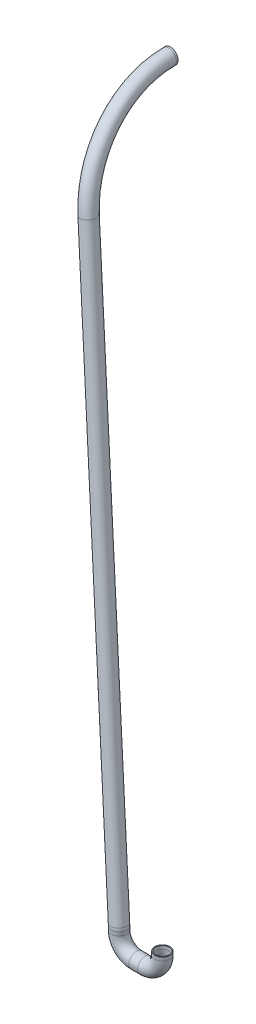
ISO-10303-21;
HEADER;
FILE_DESCRIPTION(('STEP AP214'),'2;1');
FILE_NAME('part.step','',(''),(''),'','','');
FILE_SCHEMA(('AUTOMOTIVE_DESIGN { 1 0 10303 214 1 1 1 1 }'));
ENDSEC;
DATA;
#1=APPLICATION_CONTEXT('core data for automotive mechanical design processes');
#2=APPLICATION_PROTOCOL_DEFINITION('international standard','automotive_design',2000,#1);
#3=PRODUCT_CONTEXT('',#1,'mechanical');
#4=PRODUCT('Part','Part','',(#3));
#5=PRODUCT_RELATED_PRODUCT_CATEGORY('part','',(#4));
#6=PRODUCT_DEFINITION_FORMATION('','',#4);
#7=PRODUCT_DEFINITION_CONTEXT('part definition',#1,'design');
#8=PRODUCT_DEFINITION('design','',#6,#7);
#9=PRODUCT_DEFINITION_SHAPE('','',#8);
#10=(LENGTH_UNIT() NAMED_UNIT(*) SI_UNIT(.MILLI.,.METRE.));
#11=(NAMED_UNIT(*) PLANE_ANGLE_UNIT() SI_UNIT($,.RADIAN.));
#12=(NAMED_UNIT(*) SI_UNIT($,.STERADIAN.) SOLID_ANGLE_UNIT());
#13=UNCERTAINTY_MEASURE_WITH_UNIT(LENGTH_MEASURE(1.E-05),#10,'distance_accuracy_value','');
#14=(GEOMETRIC_REPRESENTATION_CONTEXT(3) GLOBAL_UNCERTAINTY_ASSIGNED_CONTEXT((#13)) GLOBAL_UNIT_ASSIGNED_CONTEXT((#10,
#11,#12)) REPRESENTATION_CONTEXT('',''));
#15=CARTESIAN_POINT('',(0.,0.,0.));
#16=DIRECTION('',(0.,0.,1.));
#17=DIRECTION('',(1.,0.,0.));
#18=AXIS2_PLACEMENT_3D('',#15,#16,#17);
#19=CARTESIAN_POINT('',(0.,0.,0.));
#20=DIRECTION('',(0.,0.,1.));
#21=DIRECTION('',(1.,0.,0.));
#22=AXIS2_PLACEMENT_3D('',#19,#20,#21);
#23=PLANE('',#22);
#24=CARTESIAN_POINT('',(0.,0.,0.));
#25=DIRECTION('',(0.,0.,1.));
#26=DIRECTION('',(1.,0.,0.));
#27=AXIS2_PLACEMENT_3D('',#24,#25,#26);
#28=CIRCLE('',#27,15.5);
#29=CARTESIAN_POINT('',(15.5,0.,0.));
#30=VERTEX_POINT('',#29);
#31=EDGE_CURVE('E89',#30,#30,#28,.T.);
#32=ORIENTED_EDGE('',*,*,#31,.T.);
#33=EDGE_LOOP('',(#32));
#34=FACE_BOUND('',#33,.T.);
#35=CARTESIAN_POINT('',(0.,0.,0.));
#36=DIRECTION('',(0.,0.,1.));
#37=DIRECTION('',(1.,0.,0.));
#38=AXIS2_PLACEMENT_3D('',#35,#36,#37);
#39=CIRCLE('',#38,17.5);
#40=CARTESIAN_POINT('',(17.5,0.,0.));
#41=VERTEX_POINT('',#40);
#42=EDGE_CURVE('E80',#41,#41,#39,.T.);
#43=ORIENTED_EDGE('',*,*,#42,.F.);
#44=EDGE_LOOP('',(#43));
#45=FACE_BOUND('',#44,.T.);
#46=ADVANCED_FACE('F37',(#34,#45),#23,.F.);
#47=CARTESIAN_POINT('',(350.19,-1429.69,369.02));
#48=DIRECTION('',(-0.000121097109714988,0.999999960646344,0.000253066789586098));
#49=DIRECTION('',(-0.986639079314708,-7.82491960523278E-05,-0.162921211160761));
#50=AXIS2_PLACEMENT_3D('',#47,#48,#49);
#51=PLANE('',#50);
#52=CARTESIAN_POINT('',(350.19,-1429.69,369.02));
#53=DIRECTION('',(-0.000121097109714988,0.999999960646344,0.000253066789586098));
#54=DIRECTION('',(0.,-0.000253066791441648,0.999999967978599));
#55=AXIS2_PLACEMENT_3D('',#52,#53,#54);
#56=CIRCLE('',#55,15.5);
#57=CARTESIAN_POINT('',(350.19,-1429.69392253527,384.519999503668));
#58=VERTEX_POINT('',#57);
#59=EDGE_CURVE('E84',#58,#58,#56,.T.);
#60=ORIENTED_EDGE('',*,*,#59,.F.);
#61=EDGE_LOOP('',(#60));
#62=FACE_BOUND('',#61,.T.);
#63=CARTESIAN_POINT('',(350.19,-1429.69,369.02));
#64=DIRECTION('',(-0.000121097109714988,0.999999960646344,0.000253066789586098));
#65=DIRECTION('',(-0.986639079314708,-7.82491960523278E-05,-0.162921211160761));
#66=AXIS2_PLACEMENT_3D('',#63,#64,#65);
#67=CIRCLE('',#66,17.5);
#68=CARTESIAN_POINT('',(332.923816111993,-1429.69136936093,366.168878804687));
#69=VERTEX_POINT('',#68);
#70=EDGE_CURVE('E10',#69,#69,#67,.T.);
#71=ORIENTED_EDGE('',*,*,#70,.T.);
#72=EDGE_LOOP('',(#71));
#73=FACE_BOUND('',#72,.T.);
#74=ADVANCED_FACE('F153',(#62,#73),#51,.T.);
#75=CARTESIAN_POINT('',(0.,0.,0.));
#76=DIRECTION('',(0.,0.,1.));
#77=DIRECTION('',(1.,0.,0.));
#78=AXIS2_PLACEMENT_3D('',#75,#76,#77);
#79=CYLINDRICAL_SURFACE('',#78,17.5);
#80=CARTESIAN_POINT('',(0.,0.,4.1631515407503));
#81=DIRECTION('',(0.,0.,1.));
#82=DIRECTION('',(1.,0.,0.));
#83=AXIS2_PLACEMENT_3D('',#80,#81,#82);
#84=CIRCLE('',#83,17.5);
#85=CARTESIAN_POINT('',(-3.02112242323702,17.2372509207186,4.16315154075029));
#86=VERTEX_POINT('',#85);
#87=EDGE_CURVE('E76',#86,#86,#84,.T.);
#88=ORIENTED_EDGE('',*,*,#87,.F.);
#89=EDGE_LOOP('',(#88));
#90=FACE_BOUND('',#89,.T.);
#91=ORIENTED_EDGE('',*,*,#42,.T.);
#92=EDGE_LOOP('',(#91));
#93=FACE_BOUND('',#92,.T.);
#94=ADVANCED_FACE('F155',(#90,#93),#79,.T.);
#95=CARTESIAN_POINT('',(37.9798247492653,-216.696868717605,4.16315154075039));
#96=DIRECTION('',(0.984985766898206,0.172635567042115,0.));
#97=DIRECTION('',(-0.172635567042115,0.984985766898206,0.));
#98=AXIS2_PLACEMENT_3D('',#95,#96,#97);
#99=TOROIDAL_SURFACE('',#98,220.,17.5);
#100=CARTESIAN_POINT('',(33.5808684012966,-191.598278281148,222.682509816285));
#101=DIRECTION('',(0.171473696934437,-0.978356625877871,0.115823503057471));
#102=DIRECTION('',(0.973648853371707,0.150348533706177,-0.171473696934437));
#103=AXIS2_PLACEMENT_3D('',#100,#101,#102);
#104=CIRCLE('',#103,17.5);
#105=CARTESIAN_POINT('',(33.2309514190718,-189.601799496429,240.064731497294));
#106=VERTEX_POINT('',#105);
#107=EDGE_CURVE('E72',#106,#106,#104,.T.);
#108=CARTESIAN_POINT('',(37.9798247492653,-216.696868717605,4.16315154075039));
#109=DIRECTION('',(0.984985766898206,0.172635567042115,0.));
#110=DIRECTION('',(-0.172635567042115,0.984985766898206,0.));
#111=AXIS2_PLACEMENT_3D('',#108,#109,#110);
#112=CIRCLE('',#111,237.5);
#113=EDGE_CURVE('',#86,#106,#112,.T.);
#114=ORIENTED_EDGE('',*,*,#87,.T.);
#115=ORIENTED_EDGE('',*,*,#107,.F.);
#116=ORIENTED_EDGE('',*,*,#113,.T.);
#117=ORIENTED_EDGE('',*,*,#113,.F.);
#118=EDGE_LOOP('',(#114,#116,#115,#117));
#119=FACE_BOUND('',#118,.T.);
#120=ADVANCED_FACE('F161',(#119),#99,.T.);
#121=CARTESIAN_POINT('',(33.5808684012966,-191.598278281148,222.682509816285));
#122=DIRECTION('',(0.171473696934437,-0.978356625877871,0.115823503057471));
#123=DIRECTION('',(0.984985766898206,0.172635567042115,0.));
#124=AXIS2_PLACEMENT_3D('',#121,#122,#123);
#125=CYLINDRICAL_SURFACE('',#124,17.5);
#126=CARTESIAN_POINT('',(249.853076861075,-1425.55632504074,368.765584046409));
#127=DIRECTION('',(0.171473696934437,-0.978356625877871,0.115823503057471));
#128=DIRECTION('',(0.973648853371707,0.150348533706177,-0.171473696934437));
#129=AXIS2_PLACEMENT_3D('',#126,#127,#128);
#130=CIRCLE('',#129,17.5);
#131=CARTESIAN_POINT('',(264.040972205869,-1421.93512244574,378.348929884431));
#132=VERTEX_POINT('',#131);
#133=EDGE_CURVE('E68',#132,#132,#130,.T.);
#134=ORIENTED_EDGE('',*,*,#133,.F.);
#135=EDGE_LOOP('',(#134));
#136=FACE_BOUND('',#135,.T.);
#137=ORIENTED_EDGE('',*,*,#107,.T.);
#138=EDGE_LOOP('',(#137));
#139=FACE_BOUND('',#138,.T.);
#140=ADVANCED_FACE('F208',(#136,#139),#125,.T.);
#141=CARTESIAN_POINT('',(233.638339324166,-1429.69484229216,357.813188802955));
#142=DIRECTION('',(0.559734301059512,0.,-0.828672137951687));
#143=DIRECTION('',(-0.828672137951687,0.,-0.559734301059512));
#144=AXIS2_PLACEMENT_3D('',#141,#142,#143);
#145=TOROIDAL_SURFACE('',#144,20.,17.5);
#146=CARTESIAN_POINT('',(250.2117820832,-1429.69484229216,369.007874824145));
#147=DIRECTION('',(0.,-1.,0.));
#148=DIRECTION('',(0.986680284897269,0.,-0.162671495336595));
#149=AXIS2_PLACEMENT_3D('',#146,#147,#148);
#150=CIRCLE('',#149,17.5);
#151=CARTESIAN_POINT('',(264.713544497355,-1429.69484229216,378.803225092686));
#152=VERTEX_POINT('',#151);
#153=EDGE_CURVE('E64',#152,#152,#150,.T.);
#154=CARTESIAN_POINT('',(233.638339324166,-1429.69484229216,357.813188802955));
#155=DIRECTION('',(0.559734301059512,0.,-0.828672137951687));
#156=DIRECTION('',(-0.828672137951687,0.,-0.559734301059512));
#157=AXIS2_PLACEMENT_3D('',#154,#155,#156);
#158=CIRCLE('',#157,37.5);
#159=EDGE_CURVE('',#132,#152,#158,.T.);
#160=ORIENTED_EDGE('',*,*,#133,.T.);
#161=ORIENTED_EDGE('',*,*,#153,.F.);
#162=ORIENTED_EDGE('',*,*,#159,.T.);
#163=ORIENTED_EDGE('',*,*,#159,.F.);
#164=EDGE_LOOP('',(#160,#162,#161,#163));
#165=FACE_BOUND('',#164,.T.);
#166=ADVANCED_FACE('F212',(#165),#145,.T.);
#167=CARTESIAN_POINT('',(250.2117820832,-1429.69484229216,369.007874824145));
#168=DIRECTION('',(0.,-1.,0.));
#169=DIRECTION('',(0.,0.,-1.));
#170=AXIS2_PLACEMENT_3D('',#167,#168,#169);
#171=CYLINDRICAL_SURFACE('',#170,17.5);
#172=CARTESIAN_POINT('',(250.2117820832,-1437.60294581744,369.007874824145));
#173=DIRECTION('',(0.,-1.,0.));
#174=DIRECTION('',(0.986680284897269,0.,-0.162671495336595));
#175=AXIS2_PLACEMENT_3D('',#172,#173,#174);
#176=CIRCLE('',#175,17.5);
#177=CARTESIAN_POINT('',(232.7117820832,-1437.60294581744,369.007874824145));
#178=VERTEX_POINT('',#177);
#179=EDGE_CURVE('E60',#178,#178,#176,.T.);
#180=ORIENTED_EDGE('',*,*,#179,.F.);
#181=EDGE_LOOP('',(#180));
#182=FACE_BOUND('',#181,.T.);
#183=ORIENTED_EDGE('',*,*,#153,.T.);
#184=EDGE_LOOP('',(#183));
#185=FACE_BOUND('',#184,.T.);
#186=ADVANCED_FACE('F216',(#182,#185),#171,.T.);
#187=CARTESIAN_POINT('',(290.2117820832,-1437.60294581744,369.007874824145));
#188=DIRECTION('',(0.,0.,1.));
#189=DIRECTION('',(1.,0.,0.));
#190=AXIS2_PLACEMENT_3D('',#187,#188,#189);
#191=TOROIDAL_SURFACE('',#190,40.0000000000001,17.5);
#192=CARTESIAN_POINT('',(290.2117820832,-1477.60294581744,369.007874824145));
#193=DIRECTION('',(1.,0.,0.));
#194=DIRECTION('',(0.,0.986680284897269,-0.162671495336595));
#195=AXIS2_PLACEMENT_3D('',#192,#193,#194);
#196=CIRCLE('',#195,17.5);
#197=CARTESIAN_POINT('',(290.2117820832,-1495.10294581744,369.007874824145));
#198=VERTEX_POINT('',#197);
#199=EDGE_CURVE('E54',#198,#198,#196,.T.);
#200=CARTESIAN_POINT('',(290.2117820832,-1437.60294581744,369.007874824145));
#201=DIRECTION('',(0.,0.,1.));
#202=DIRECTION('',(1.,0.,0.));
#203=AXIS2_PLACEMENT_3D('',#200,#201,#202);
#204=CIRCLE('',#203,57.5000000000001);
#205=EDGE_CURVE('',#178,#198,#204,.T.);
#206=ORIENTED_EDGE('',*,*,#179,.T.);
#207=ORIENTED_EDGE('',*,*,#199,.F.);
#208=ORIENTED_EDGE('',*,*,#205,.T.);
#209=ORIENTED_EDGE('',*,*,#205,.F.);
#210=EDGE_LOOP('',(#206,#208,#207,#209));
#211=FACE_BOUND('',#210,.T.);
#212=ADVANCED_FACE('F220',(#211),#191,.T.);
#213=CARTESIAN_POINT('',(290.2117820832,-1477.60294581744,369.007874824145));
#214=DIRECTION('',(1.,0.,0.));
#215=DIRECTION('',(0.,0.,-1.));
#216=AXIS2_PLACEMENT_3D('',#213,#214,#215);
#217=CYLINDRICAL_SURFACE('',#216,17.5);
#218=CARTESIAN_POINT('',(310.190957941771,-1477.60294581744,369.007874824145));
#219=DIRECTION('',(1.,0.,0.));
#220=DIRECTION('',(0.,0.986680284897269,-0.162671495336595));
#221=AXIS2_PLACEMENT_3D('',#218,#219,#220);
#222=CIRCLE('',#221,17.5);
#223=CARTESIAN_POINT('',(310.190957941771,-1495.10294525706,369.003446155295));
#224=VERTEX_POINT('',#223);
#225=EDGE_CURVE('E49',#224,#224,#222,.T.);
#226=ORIENTED_EDGE('',*,*,#225,.F.);
#227=EDGE_LOOP('',(#226));
#228=FACE_BOUND('',#227,.T.);
#229=ORIENTED_EDGE('',*,*,#199,.T.);
#230=EDGE_LOOP('',(#229));
#231=FACE_BOUND('',#230,.T.);
#232=ADVANCED_FACE('F149',(#228,#231),#217,.T.);
#233=CARTESIAN_POINT('',(310.190957941771,-1437.60294709829,369.017997495803));
#234=DIRECTION('',(0.,-0.000253066791461309,0.999999967978599));
#235=DIRECTION('',(0.,-0.999999967978599,-0.000253066791461309));
#236=AXIS2_PLACEMENT_3D('',#233,#234,#235);
#237=TOROIDAL_SURFACE('',#236,40.0000000000002,17.5);
#238=CARTESIAN_POINT('',(350.19095764848,-1437.59810321406,369.017998721629));
#239=DIRECTION('',(-0.000121097109709556,0.999999960646344,0.000253066789605759));
#240=DIRECTION('',(-0.986639079314708,-7.82491960437652E-05,-0.162921211160761));
#241=AXIS2_PLACEMENT_3D('',#238,#239,#240);
#242=CIRCLE('',#241,17.5);
#243=CARTESIAN_POINT('',(367.690957520166,-1437.59598401471,369.017999257928));
#244=VERTEX_POINT('',#243);
#245=EDGE_CURVE('E44',#244,#244,#242,.T.);
#246=CARTESIAN_POINT('',(310.190957941771,-1437.60294709829,369.017997495803));
#247=DIRECTION('',(0.,-0.000253066791461309,0.999999967978599));
#248=DIRECTION('',(0.,-0.999999967978599,-0.000253066791461309));
#249=AXIS2_PLACEMENT_3D('',#246,#247,#248);
#250=CIRCLE('',#249,57.5000000000002);
#251=EDGE_CURVE('',#224,#244,#250,.T.);
#252=ORIENTED_EDGE('',*,*,#225,.T.);
#253=ORIENTED_EDGE('',*,*,#245,.F.);
#254=ORIENTED_EDGE('',*,*,#251,.T.);
#255=ORIENTED_EDGE('',*,*,#251,.F.);
#256=EDGE_LOOP('',(#252,#254,#253,#255));
#257=FACE_BOUND('',#256,.T.);
#258=ADVANCED_FACE('F143',(#257),#237,.T.);
#259=CARTESIAN_POINT('',(350.19095764848,-1437.59810321406,369.017998721629));
#260=DIRECTION('',(-0.000121097109714988,0.999999960646344,0.000253066789586098));
#261=DIRECTION('',(0.,-0.000253066791441648,0.999999967978599));
#262=AXIS2_PLACEMENT_3D('',#259,#260,#261);
#263=CYLINDRICAL_SURFACE('',#262,17.5);
#264=ORIENTED_EDGE('',*,*,#70,.F.);
#265=EDGE_LOOP('',(#264));
#266=FACE_BOUND('',#265,.T.);
#267=ORIENTED_EDGE('',*,*,#245,.T.);
#268=EDGE_LOOP('',(#267));
#269=FACE_BOUND('',#268,.T.);
#270=ADVANCED_FACE('F140',(#266,#269),#263,.T.);
#271=CARTESIAN_POINT('',(0.,0.,0.));
#272=DIRECTION('',(0.,0.,1.));
#273=DIRECTION('',(1.,0.,0.));
#274=AXIS2_PLACEMENT_3D('',#271,#272,#273);
#275=CYLINDRICAL_SURFACE('',#274,15.5);
#276=CARTESIAN_POINT('',(0.,0.,4.16315154075039));
#277=DIRECTION('',(0.,0.,-1.));
#278=DIRECTION('',(-1.,0.,0.));
#279=AXIS2_PLACEMENT_3D('',#276,#277,#278);
#280=CIRCLE('',#279,15.5);
#281=CARTESIAN_POINT('',(-2.67585128915278,15.2672793869221,4.16315154075039));
#282=VERTEX_POINT('',#281);
#283=EDGE_CURVE('E93',#282,#282,#280,.F.);
#284=ORIENTED_EDGE('',*,*,#283,.T.);
#285=EDGE_LOOP('',(#284));
#286=FACE_BOUND('',#285,.T.);
#287=ORIENTED_EDGE('',*,*,#31,.F.);
#288=EDGE_LOOP('',(#287));
#289=FACE_BOUND('',#288,.T.);
#290=ADVANCED_FACE('F125',(#286,#289),#275,.F.);
#291=CARTESIAN_POINT('',(37.9798247492653,-216.696868717605,4.16315154075039));
#292=DIRECTION('',(0.984985766898206,0.172635567042115,0.));
#293=DIRECTION('',(-0.172635567042115,0.984985766898206,0.));
#294=AXIS2_PLACEMENT_3D('',#291,#292,#293);
#295=TOROIDAL_SURFACE('',#294,220.,15.5);
#296=CARTESIAN_POINT('',(33.5808684012966,-191.598278281148,222.682509816285));
#297=DIRECTION('',(0.171473696934437,-0.978356625877871,0.115823503057471));
#298=DIRECTION('',(0.984985766898206,0.172635567042115,0.));
#299=AXIS2_PLACEMENT_3D('',#296,#297,#298);
#300=CIRCLE('',#299,15.5);
#301=CARTESIAN_POINT('',(33.2709419313261,-189.829968500397,238.078191876607));
#302=VERTEX_POINT('',#301);
#303=EDGE_CURVE('E117',#302,#302,#300,.T.);
#304=CARTESIAN_POINT('',(37.9798247492653,-216.696868717605,4.16315154075039));
#305=DIRECTION('',(0.984985766898206,0.172635567042115,0.));
#306=DIRECTION('',(-0.172635567042115,0.984985766898206,0.));
#307=AXIS2_PLACEMENT_3D('',#304,#305,#306);
#308=CIRCLE('',#307,235.5);
#309=EDGE_CURVE('',#282,#302,#308,.T.);
#310=ORIENTED_EDGE('',*,*,#283,.F.);
#311=ORIENTED_EDGE('',*,*,#303,.T.);
#312=ORIENTED_EDGE('',*,*,#309,.T.);
#313=ORIENTED_EDGE('',*,*,#309,.F.);
#314=EDGE_LOOP('',(#310,#312,#311,#313));
#315=FACE_BOUND('',#314,.T.);
#316=ADVANCED_FACE('F128',(#315),#295,.F.);
#317=CARTESIAN_POINT('',(33.5808684012966,-191.598278281148,222.682509816285));
#318=DIRECTION('',(0.171473696934437,-0.978356625877871,0.115823503057471));
#319=DIRECTION('',(0.984985766898206,0.172635567042115,0.));
#320=AXIS2_PLACEMENT_3D('',#317,#318,#319);
#321=CYLINDRICAL_SURFACE('',#320,15.5);
#322=CARTESIAN_POINT('',(249.853076861075,-1425.55632504074,368.765584046409));
#323=DIRECTION('',(-0.171473696934397,0.978356625877882,-0.115823503057443));
#324=DIRECTION('',(-0.984985766898213,-0.172635567042074,0.));
#325=AXIS2_PLACEMENT_3D('',#322,#323,#324);
#326=CIRCLE('',#325,15.5);
#327=CARTESIAN_POINT('',(262.419498452179,-1422.34897417089,377.253690360086));
#328=VERTEX_POINT('',#327);
#329=EDGE_CURVE('E113',#328,#328,#326,.F.);
#330=ORIENTED_EDGE('',*,*,#329,.T.);
#331=EDGE_LOOP('',(#330));
#332=FACE_BOUND('',#331,.T.);
#333=ORIENTED_EDGE('',*,*,#303,.F.);
#334=EDGE_LOOP('',(#333));
#335=FACE_BOUND('',#334,.T.);
#336=ADVANCED_FACE('F130',(#332,#335),#321,.F.);
#337=CARTESIAN_POINT('',(233.638339324166,-1429.69484229216,357.813188802955));
#338=DIRECTION('',(0.559734301059512,0.,-0.828672137951687));
#339=DIRECTION('',(-0.828672137951687,0.,-0.559734301059512));
#340=AXIS2_PLACEMENT_3D('',#337,#338,#339);
#341=TOROIDAL_SURFACE('',#340,20.,15.5);
#342=CARTESIAN_POINT('',(250.2117820832,-1429.69484229216,369.007874824145));
#343=DIRECTION('',(0.,-1.,0.));
#344=DIRECTION('',(0.,0.,-1.));
#345=AXIS2_PLACEMENT_3D('',#342,#343,#344);
#346=CIRCLE('',#345,15.5);
#347=CARTESIAN_POINT('',(263.056200221451,-1429.69484229216,377.683756490568));
#348=VERTEX_POINT('',#347);
#349=EDGE_CURVE('E109',#348,#348,#346,.T.);
#350=CARTESIAN_POINT('',(233.638339324166,-1429.69484229216,357.813188802955));
#351=DIRECTION('',(0.559734301059512,0.,-0.828672137951687));
#352=DIRECTION('',(-0.828672137951687,0.,-0.559734301059512));
#353=AXIS2_PLACEMENT_3D('',#350,#351,#352);
#354=CIRCLE('',#353,35.5);
#355=EDGE_CURVE('',#328,#348,#354,.T.);
#356=ORIENTED_EDGE('',*,*,#329,.F.);
#357=ORIENTED_EDGE('',*,*,#349,.T.);
#358=ORIENTED_EDGE('',*,*,#355,.T.);
#359=ORIENTED_EDGE('',*,*,#355,.F.);
#360=EDGE_LOOP('',(#356,#358,#357,#359));
#361=FACE_BOUND('',#360,.T.);
#362=ADVANCED_FACE('F137',(#361),#341,.F.);
#363=CARTESIAN_POINT('',(250.2117820832,-1429.69484229216,369.007874824145));
#364=DIRECTION('',(0.,-1.,0.));
#365=DIRECTION('',(0.,0.,-1.));
#366=AXIS2_PLACEMENT_3D('',#363,#364,#365);
#367=CYLINDRICAL_SURFACE('',#366,15.5);
#368=CARTESIAN_POINT('',(250.2117820832,-1437.60294581744,369.007874824145));
#369=DIRECTION('',(0.,1.,0.));
#370=DIRECTION('',(-1.,0.,0.));
#371=AXIS2_PLACEMENT_3D('',#368,#369,#370);
#372=CIRCLE('',#371,15.5);
#373=CARTESIAN_POINT('',(234.7117820832,-1437.60294581744,369.007874824145));
#374=VERTEX_POINT('',#373);
#375=EDGE_CURVE('E105',#374,#374,#372,.F.);
#376=ORIENTED_EDGE('',*,*,#375,.T.);
#377=EDGE_LOOP('',(#376));
#378=FACE_BOUND('',#377,.T.);
#379=ORIENTED_EDGE('',*,*,#349,.F.);
#380=EDGE_LOOP('',(#379));
#381=FACE_BOUND('',#380,.T.);
#382=ADVANCED_FACE('F188',(#378,#381),#367,.F.);
#383=CARTESIAN_POINT('',(290.2117820832,-1437.60294581744,369.007874824145));
#384=DIRECTION('',(0.,0.,1.));
#385=DIRECTION('',(1.,0.,0.));
#386=AXIS2_PLACEMENT_3D('',#383,#384,#385);
#387=TOROIDAL_SURFACE('',#386,40.0000000000001,15.5);
#388=CARTESIAN_POINT('',(290.2117820832,-1477.60294581744,369.007874824145));
#389=DIRECTION('',(1.,0.,0.));
#390=DIRECTION('',(0.,0.,-1.));
#391=AXIS2_PLACEMENT_3D('',#388,#389,#390);
#392=CIRCLE('',#391,15.5);
#393=CARTESIAN_POINT('',(290.2117820832,-1493.10294581744,369.007874824145));
#394=VERTEX_POINT('',#393);
#395=EDGE_CURVE('E101',#394,#394,#392,.T.);
#396=CARTESIAN_POINT('',(290.2117820832,-1437.60294581744,369.007874824145));
#397=DIRECTION('',(0.,0.,1.));
#398=DIRECTION('',(1.,0.,0.));
#399=AXIS2_PLACEMENT_3D('',#396,#397,#398);
#400=CIRCLE('',#399,55.5000000000002);
#401=EDGE_CURVE('',#374,#394,#400,.T.);
#402=ORIENTED_EDGE('',*,*,#375,.F.);
#403=ORIENTED_EDGE('',*,*,#395,.T.);
#404=ORIENTED_EDGE('',*,*,#401,.T.);
#405=ORIENTED_EDGE('',*,*,#401,.F.);
#406=EDGE_LOOP('',(#402,#404,#403,#405));
#407=FACE_BOUND('',#406,.T.);
#408=ADVANCED_FACE('F182',(#407),#387,.F.);
#409=CARTESIAN_POINT('',(290.2117820832,-1477.60294581744,369.007874824145));
#410=DIRECTION('',(1.,0.,0.));
#411=DIRECTION('',(0.,0.,-1.));
#412=AXIS2_PLACEMENT_3D('',#409,#410,#411);
#413=CYLINDRICAL_SURFACE('',#412,15.5);
#414=CARTESIAN_POINT('',(310.190957941771,-1477.60294581744,369.007874824144));
#415=DIRECTION('',(-1.,0.,0.));
#416=DIRECTION('',(0.,0.,1.));
#417=AXIS2_PLACEMENT_3D('',#414,#415,#416);
#418=CIRCLE('',#417,15.5);
#419=CARTESIAN_POINT('',(310.190957941771,-1493.10294532111,369.003952288877));
#420=VERTEX_POINT('',#419);
#421=EDGE_CURVE('E97',#420,#420,#418,.F.);
#422=ORIENTED_EDGE('',*,*,#421,.T.);
#423=EDGE_LOOP('',(#422));
#424=FACE_BOUND('',#423,.T.);
#425=ORIENTED_EDGE('',*,*,#395,.F.);
#426=EDGE_LOOP('',(#425));
#427=FACE_BOUND('',#426,.T.);
#428=ADVANCED_FACE('F176',(#424,#427),#413,.F.);
#429=CARTESIAN_POINT('',(310.190957941771,-1437.60294709829,369.017997495803));
#430=DIRECTION('',(0.,-0.000253066791461309,0.999999967978599));
#431=DIRECTION('',(0.,-0.999999967978599,-0.000253066791461309));
#432=AXIS2_PLACEMENT_3D('',#429,#430,#431);
#433=TOROIDAL_SURFACE('',#432,40.0000000000002,15.5);
#434=CARTESIAN_POINT('',(350.19095764848,-1437.59810321406,369.017998721629));
#435=DIRECTION('',(-0.000121097109714988,0.999999960646344,0.000253066789586098));
#436=DIRECTION('',(0.,-0.000253066791441648,0.999999967978599));
#437=AXIS2_PLACEMENT_3D('',#434,#435,#436);
#438=CIRCLE('',#437,15.5);
#439=CARTESIAN_POINT('',(365.690957534831,-1437.59622620892,369.017999196637));
#440=VERTEX_POINT('',#439);
#441=EDGE_CURVE('E88',#440,#440,#438,.T.);
#442=CARTESIAN_POINT('',(310.190957941771,-1437.60294709829,369.017997495803));
#443=DIRECTION('',(0.,-0.000253066791461309,0.999999967978599));
#444=DIRECTION('',(0.,-0.999999967978599,-0.000253066791461309));
#445=AXIS2_PLACEMENT_3D('',#442,#443,#444);
#446=CIRCLE('',#445,55.5000000000002);
#447=EDGE_CURVE('',#420,#440,#446,.T.);
#448=ORIENTED_EDGE('',*,*,#421,.F.);
#449=ORIENTED_EDGE('',*,*,#441,.T.);
#450=ORIENTED_EDGE('',*,*,#447,.T.);
#451=ORIENTED_EDGE('',*,*,#447,.F.);
#452=EDGE_LOOP('',(#448,#450,#449,#451));
#453=FACE_BOUND('',#452,.T.);
#454=ADVANCED_FACE('F170',(#453),#433,.F.);
#455=CARTESIAN_POINT('',(350.19095764848,-1437.59810321406,369.017998721629));
#456=DIRECTION('',(-0.000121097109714988,0.999999960646344,0.000253066789586098));
#457=DIRECTION('',(0.,-0.000253066791441648,0.999999967978599));
#458=AXIS2_PLACEMENT_3D('',#455,#456,#457);
#459=CYLINDRICAL_SURFACE('',#458,15.5);
#460=ORIENTED_EDGE('',*,*,#59,.T.);
#461=EDGE_LOOP('',(#460));
#462=FACE_BOUND('',#461,.T.);
#463=ORIENTED_EDGE('',*,*,#441,.F.);
#464=EDGE_LOOP('',(#463));
#465=FACE_BOUND('',#464,.T.);
#466=ADVANCED_FACE('F165',(#462,#465),#459,.F.);
#467=CLOSED_SHELL('',(#46,#74,#94,#120,#140,#166,#186,#212,#232,#258,#270,#290,#316,#336,#362,
#382,#408,#428,#454,#466));
#468=MANIFOLD_SOLID_BREP('B2',#467);
#469=ADVANCED_BREP_SHAPE_REPRESENTATION('',(#18,#468),#14);
#470=SHAPE_DEFINITION_REPRESENTATION(#9,#469);
ENDSEC;
END-ISO-10303-21;
